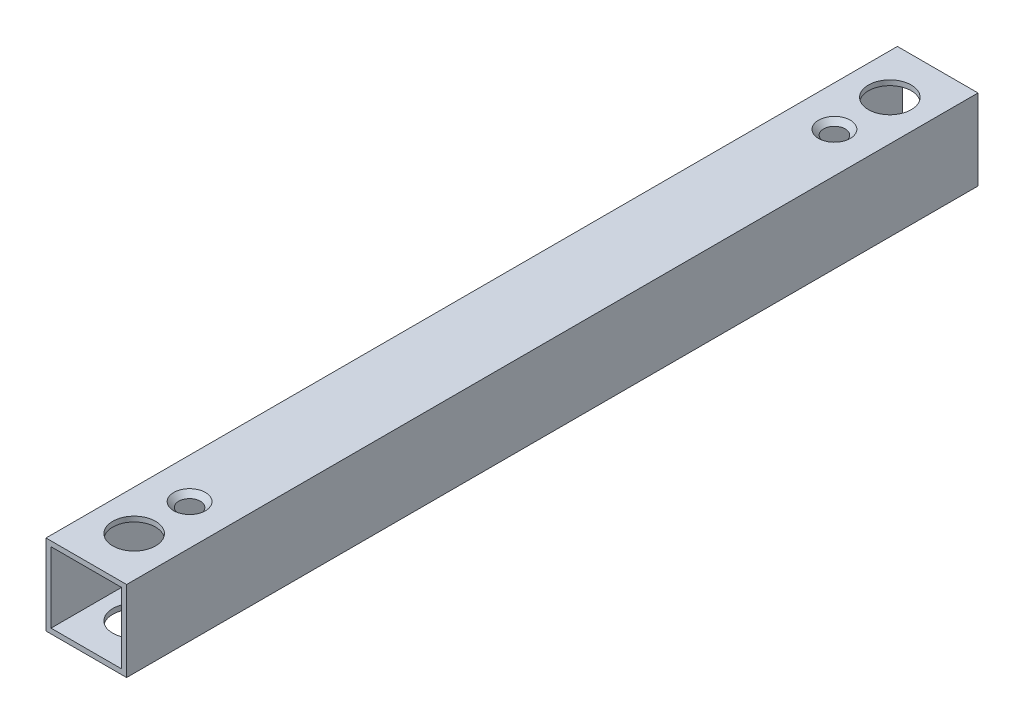
ISO-10303-21;
HEADER;
FILE_DESCRIPTION(('STEP AP214'),'2;1');
FILE_NAME('part.step','',(''),(''),'','','');
FILE_SCHEMA(('AUTOMOTIVE_DESIGN { 1 0 10303 214 1 1 1 1 }'));
ENDSEC;
DATA;
#1=APPLICATION_CONTEXT('core data for automotive mechanical design processes');
#2=APPLICATION_PROTOCOL_DEFINITION('international standard','automotive_design',2000,#1);
#3=PRODUCT_CONTEXT('',#1,'mechanical');
#4=PRODUCT('Part','Part','',(#3));
#5=PRODUCT_RELATED_PRODUCT_CATEGORY('part','',(#4));
#6=PRODUCT_DEFINITION_FORMATION('','',#4);
#7=PRODUCT_DEFINITION_CONTEXT('part definition',#1,'design');
#8=PRODUCT_DEFINITION('design','',#6,#7);
#9=PRODUCT_DEFINITION_SHAPE('','',#8);
#10=(LENGTH_UNIT() NAMED_UNIT(*) SI_UNIT(.MILLI.,.METRE.));
#11=(NAMED_UNIT(*) PLANE_ANGLE_UNIT() SI_UNIT($,.RADIAN.));
#12=(NAMED_UNIT(*) SI_UNIT($,.STERADIAN.) SOLID_ANGLE_UNIT());
#13=UNCERTAINTY_MEASURE_WITH_UNIT(LENGTH_MEASURE(1.E-05),#10,'distance_accuracy_value','');
#14=(GEOMETRIC_REPRESENTATION_CONTEXT(3) GLOBAL_UNCERTAINTY_ASSIGNED_CONTEXT((#13)) GLOBAL_UNIT_ASSIGNED_CONTEXT((#10,
#11,#12)) REPRESENTATION_CONTEXT('',''));
#15=CARTESIAN_POINT('',(0.,0.,0.));
#16=DIRECTION('',(0.,0.,1.));
#17=DIRECTION('',(1.,0.,0.));
#18=AXIS2_PLACEMENT_3D('',#15,#16,#17);
#19=CARTESIAN_POINT('',(8.,-8.,-191.62741699797));
#20=DIRECTION('',(1.,0.,0.));
#21=DIRECTION('',(0.,0.,-1.));
#22=AXIS2_PLACEMENT_3D('',#19,#20,#21);
#23=PLANE('',#22);
#24=DIRECTION('',(0.,0.,1.));
#25=VECTOR('',#24,1.);
#26=CARTESIAN_POINT('',(8.,-8.,-191.62741699797));
#27=LINE('',#26,#25);
#28=CARTESIAN_POINT('',(8.,-8.,-169.));
#29=VERTEX_POINT('',#28);
#30=CARTESIAN_POINT('',(8.,-8.,0.));
#31=VERTEX_POINT('',#30);
#32=EDGE_CURVE('E163',#29,#31,#27,.T.);
#33=ORIENTED_EDGE('',*,*,#32,.F.);
#34=DIRECTION('',(0.,1.,0.));
#35=VECTOR('',#34,1.);
#36=CARTESIAN_POINT('',(8.,-8.,-169.));
#37=LINE('',#36,#35);
#38=CARTESIAN_POINT('',(8.,8.,-169.));
#39=VERTEX_POINT('',#38);
#40=EDGE_CURVE('E155',#29,#39,#37,.T.);
#41=ORIENTED_EDGE('',*,*,#40,.T.);
#42=DIRECTION('',(0.,0.,1.));
#43=VECTOR('',#42,1.);
#44=CARTESIAN_POINT('',(8.,8.,-191.62741699797));
#45=LINE('',#44,#43);
#46=CARTESIAN_POINT('',(8.,8.,0.));
#47=VERTEX_POINT('',#46);
#48=EDGE_CURVE('E157',#39,#47,#45,.T.);
#49=ORIENTED_EDGE('',*,*,#48,.T.);
#50=DIRECTION('',(0.,1.,0.));
#51=VECTOR('',#50,1.);
#52=CARTESIAN_POINT('',(8.,-8.,0.));
#53=LINE('',#52,#51);
#54=EDGE_CURVE('E259',#31,#47,#53,.T.);
#55=ORIENTED_EDGE('',*,*,#54,.F.);
#56=EDGE_LOOP('',(#33,#41,#49,#55));
#57=FACE_BOUND('',#56,.T.);
#58=ADVANCED_FACE('F43',(#57),#23,.T.);
#59=CARTESIAN_POINT('',(-8.,-8.,-191.62741699797));
#60=DIRECTION('',(0.,-1.,0.));
#61=DIRECTION('',(0.,0.,-1.));
#62=AXIS2_PLACEMENT_3D('',#59,#60,#61);
#63=PLANE('',#62);
#64=CARTESIAN_POINT('',(0.,-8.,-20.5));
#65=DIRECTION('',(0.,-1.,0.));
#66=DIRECTION('',(0.,0.,-1.));
#67=AXIS2_PLACEMENT_3D('',#64,#65,#66);
#68=CIRCLE('',#67,3.15);
#69=CARTESIAN_POINT('',(0.,-8.,-23.65));
#70=VERTEX_POINT('',#69);
#71=EDGE_CURVE('E206',#70,#70,#68,.T.);
#72=ORIENTED_EDGE('',*,*,#71,.F.);
#73=EDGE_LOOP('',(#72));
#74=FACE_BOUND('',#73,.T.);
#75=CARTESIAN_POINT('',(0.,-8.,-148.5));
#76=DIRECTION('',(0.,-1.,0.));
#77=DIRECTION('',(0.,0.,-1.));
#78=AXIS2_PLACEMENT_3D('',#75,#76,#77);
#79=CIRCLE('',#78,3.15);
#80=CARTESIAN_POINT('',(0.,-8.,-151.65));
#81=VERTEX_POINT('',#80);
#82=EDGE_CURVE('E202',#81,#81,#79,.T.);
#83=ORIENTED_EDGE('',*,*,#82,.F.);
#84=EDGE_LOOP('',(#83));
#85=FACE_BOUND('',#84,.T.);
#86=CARTESIAN_POINT('',(0.,-8.,-159.5));
#87=DIRECTION('',(0.,1.,0.));
#88=DIRECTION('',(0.,0.,1.));
#89=AXIS2_PLACEMENT_3D('',#86,#87,#88);
#90=CIRCLE('',#89,4.25);
#91=CARTESIAN_POINT('',(0.,-8.,-155.25));
#92=VERTEX_POINT('',#91);
#93=EDGE_CURVE('E192',#92,#92,#90,.T.);
#94=ORIENTED_EDGE('',*,*,#93,.T.);
#95=EDGE_LOOP('',(#94));
#96=FACE_BOUND('',#95,.T.);
#97=CARTESIAN_POINT('',(0.,-8.,-9.5));
#98=DIRECTION('',(0.,1.,0.));
#99=DIRECTION('',(0.,0.,1.));
#100=AXIS2_PLACEMENT_3D('',#97,#98,#99);
#101=CIRCLE('',#100,4.25);
#102=CARTESIAN_POINT('',(0.,-8.,-5.25));
#103=VERTEX_POINT('',#102);
#104=EDGE_CURVE('E201',#103,#103,#101,.T.);
#105=ORIENTED_EDGE('',*,*,#104,.T.);
#106=EDGE_LOOP('',(#105));
#107=FACE_BOUND('',#106,.T.);
#108=DIRECTION('',(0.,0.,1.));
#109=VECTOR('',#108,1.);
#110=CARTESIAN_POINT('',(-8.,-8.,-191.62741699797));
#111=LINE('',#110,#109);
#112=CARTESIAN_POINT('',(-8.,-8.,-169.));
#113=VERTEX_POINT('',#112);
#114=CARTESIAN_POINT('',(-8.,-8.,0.));
#115=VERTEX_POINT('',#114);
#116=EDGE_CURVE('E167',#113,#115,#111,.T.);
#117=ORIENTED_EDGE('',*,*,#116,.F.);
#118=DIRECTION('',(1.,0.,0.));
#119=VECTOR('',#118,1.);
#120=CARTESIAN_POINT('',(-8.,-8.,-169.));
#121=LINE('',#120,#119);
#122=EDGE_CURVE('E159',#113,#29,#121,.T.);
#123=ORIENTED_EDGE('',*,*,#122,.T.);
#124=ORIENTED_EDGE('',*,*,#32,.T.);
#125=DIRECTION('',(1.,0.,0.));
#126=VECTOR('',#125,1.);
#127=CARTESIAN_POINT('',(-8.,-8.,0.));
#128=LINE('',#127,#126);
#129=EDGE_CURVE('E150',#115,#31,#128,.T.);
#130=ORIENTED_EDGE('',*,*,#129,.F.);
#131=EDGE_LOOP('',(#117,#123,#124,#130));
#132=FACE_BOUND('',#131,.T.);
#133=ADVANCED_FACE('F293',(#74,#85,#96,#107,#132),#63,.T.);
#134=CARTESIAN_POINT('',(-8.,-8.,-191.62741699797));
#135=DIRECTION('',(-1.,0.,0.));
#136=DIRECTION('',(0.,0.,1.));
#137=AXIS2_PLACEMENT_3D('',#134,#135,#136);
#138=PLANE('',#137);
#139=DIRECTION('',(0.,0.,1.));
#140=VECTOR('',#139,1.);
#141=CARTESIAN_POINT('',(-8.,8.,-191.62741699797));
#142=LINE('',#141,#140);
#143=CARTESIAN_POINT('',(-8.,8.,-169.));
#144=VERTEX_POINT('',#143);
#145=CARTESIAN_POINT('',(-8.,8.,0.));
#146=VERTEX_POINT('',#145);
#147=EDGE_CURVE('E173',#144,#146,#142,.T.);
#148=ORIENTED_EDGE('',*,*,#147,.F.);
#149=DIRECTION('',(0.,-1.,0.));
#150=VECTOR('',#149,1.);
#151=CARTESIAN_POINT('',(-8.,-8.,-169.));
#152=LINE('',#151,#150);
#153=EDGE_CURVE('E164',#144,#113,#152,.T.);
#154=ORIENTED_EDGE('',*,*,#153,.T.);
#155=ORIENTED_EDGE('',*,*,#116,.T.);
#156=DIRECTION('',(0.,-1.,0.));
#157=VECTOR('',#156,1.);
#158=CARTESIAN_POINT('',(-8.,-8.,0.));
#159=LINE('',#158,#157);
#160=EDGE_CURVE('E251',#146,#115,#159,.T.);
#161=ORIENTED_EDGE('',*,*,#160,.F.);
#162=EDGE_LOOP('',(#148,#154,#155,#161));
#163=FACE_BOUND('',#162,.T.);
#164=ADVANCED_FACE('F299',(#163),#138,.T.);
#165=CARTESIAN_POINT('',(-8.,8.,-191.62741699797));
#166=DIRECTION('',(0.,1.,0.));
#167=DIRECTION('',(0.,0.,1.));
#168=AXIS2_PLACEMENT_3D('',#165,#166,#167);
#169=PLANE('',#168);
#170=CARTESIAN_POINT('',(0.,8.,-148.5));
#171=DIRECTION('',(0.,1.,0.));
#172=DIRECTION('',(0.,0.,1.));
#173=AXIS2_PLACEMENT_3D('',#170,#171,#172);
#174=CIRCLE('',#173,3.15);
#175=CARTESIAN_POINT('',(0.,8.,-145.35));
#176=VERTEX_POINT('',#175);
#177=EDGE_CURVE('E222',#176,#176,#174,.T.);
#178=ORIENTED_EDGE('',*,*,#177,.F.);
#179=EDGE_LOOP('',(#178));
#180=FACE_BOUND('',#179,.T.);
#181=CARTESIAN_POINT('',(0.,8.,-20.5));
#182=DIRECTION('',(0.,1.,0.));
#183=DIRECTION('',(0.,0.,1.));
#184=AXIS2_PLACEMENT_3D('',#181,#182,#183);
#185=CIRCLE('',#184,3.15);
#186=CARTESIAN_POINT('',(0.,8.,-17.35));
#187=VERTEX_POINT('',#186);
#188=EDGE_CURVE('E210',#187,#187,#185,.T.);
#189=ORIENTED_EDGE('',*,*,#188,.F.);
#190=EDGE_LOOP('',(#189));
#191=FACE_BOUND('',#190,.T.);
#192=CARTESIAN_POINT('',(0.,8.,-159.5));
#193=DIRECTION('',(0.,1.,0.));
#194=DIRECTION('',(0.,0.,1.));
#195=AXIS2_PLACEMENT_3D('',#192,#193,#194);
#196=CIRCLE('',#195,4.25);
#197=CARTESIAN_POINT('',(0.,8.,-155.25));
#198=VERTEX_POINT('',#197);
#199=EDGE_CURVE('E231',#198,#198,#196,.T.);
#200=ORIENTED_EDGE('',*,*,#199,.F.);
#201=EDGE_LOOP('',(#200));
#202=FACE_BOUND('',#201,.T.);
#203=CARTESIAN_POINT('',(0.,8.,-9.5));
#204=DIRECTION('',(0.,1.,0.));
#205=DIRECTION('',(0.,0.,1.));
#206=AXIS2_PLACEMENT_3D('',#203,#204,#205);
#207=CIRCLE('',#206,4.25);
#208=CARTESIAN_POINT('',(0.,8.,-5.25));
#209=VERTEX_POINT('',#208);
#210=EDGE_CURVE('E235',#209,#209,#207,.T.);
#211=ORIENTED_EDGE('',*,*,#210,.F.);
#212=EDGE_LOOP('',(#211));
#213=FACE_BOUND('',#212,.T.);
#214=ORIENTED_EDGE('',*,*,#48,.F.);
#215=DIRECTION('',(-1.,0.,0.));
#216=VECTOR('',#215,1.);
#217=CARTESIAN_POINT('',(-8.,8.,-169.));
#218=LINE('',#217,#216);
#219=EDGE_CURVE('E65',#39,#144,#218,.T.);
#220=ORIENTED_EDGE('',*,*,#219,.T.);
#221=ORIENTED_EDGE('',*,*,#147,.T.);
#222=DIRECTION('',(-1.,0.,0.));
#223=VECTOR('',#222,1.);
#224=CARTESIAN_POINT('',(-8.,8.,0.));
#225=LINE('',#224,#223);
#226=EDGE_CURVE('E255',#47,#146,#225,.T.);
#227=ORIENTED_EDGE('',*,*,#226,.F.);
#228=EDGE_LOOP('',(#214,#220,#221,#227));
#229=FACE_BOUND('',#228,.T.);
#230=ADVANCED_FACE('F290',(#180,#191,#202,#213,#229),#169,.T.);
#231=CARTESIAN_POINT('',(7.,-7.,-191.62741699797));
#232=DIRECTION('',(1.,0.,0.));
#233=DIRECTION('',(0.,0.,-1.));
#234=AXIS2_PLACEMENT_3D('',#231,#232,#233);
#235=PLANE('',#234);
#236=DIRECTION('',(0.,1.,0.));
#237=VECTOR('',#236,1.);
#238=CARTESIAN_POINT('',(7.,-7.,-169.));
#239=LINE('',#238,#237);
#240=CARTESIAN_POINT('',(7.,-7.,-169.));
#241=VERTEX_POINT('',#240);
#242=CARTESIAN_POINT('',(7.,7.,-169.));
#243=VERTEX_POINT('',#242);
#244=EDGE_CURVE('E124',#241,#243,#239,.T.);
#245=ORIENTED_EDGE('',*,*,#244,.F.);
#246=DIRECTION('',(0.,0.,1.));
#247=VECTOR('',#246,1.);
#248=CARTESIAN_POINT('',(7.,-7.,-191.62741699797));
#249=LINE('',#248,#247);
#250=CARTESIAN_POINT('',(7.,-7.,0.));
#251=VERTEX_POINT('',#250);
#252=EDGE_CURVE('E176',#241,#251,#249,.T.);
#253=ORIENTED_EDGE('',*,*,#252,.T.);
#254=DIRECTION('',(0.,1.,0.));
#255=VECTOR('',#254,1.);
#256=CARTESIAN_POINT('',(7.,-7.,0.));
#257=LINE('',#256,#255);
#258=CARTESIAN_POINT('',(7.,7.,0.));
#259=VERTEX_POINT('',#258);
#260=EDGE_CURVE('E127',#251,#259,#257,.T.);
#261=ORIENTED_EDGE('',*,*,#260,.T.);
#262=DIRECTION('',(0.,0.,1.));
#263=VECTOR('',#262,1.);
#264=CARTESIAN_POINT('',(7.,7.,-191.62741699797));
#265=LINE('',#264,#263);
#266=EDGE_CURVE('E120',#243,#259,#265,.T.);
#267=ORIENTED_EDGE('',*,*,#266,.F.);
#268=EDGE_LOOP('',(#245,#253,#261,#267));
#269=FACE_BOUND('',#268,.T.);
#270=ADVANCED_FACE('F122',(#269),#235,.F.);
#271=CARTESIAN_POINT('',(-7.,-7.,-191.62741699797));
#272=DIRECTION('',(0.,-1.,0.));
#273=DIRECTION('',(0.,0.,-1.));
#274=AXIS2_PLACEMENT_3D('',#271,#272,#273);
#275=PLANE('',#274);
#276=CARTESIAN_POINT('',(0.,-7.,-20.5));
#277=DIRECTION('',(0.,-1.,0.));
#278=DIRECTION('',(0.,0.,-1.));
#279=AXIS2_PLACEMENT_3D('',#276,#277,#278);
#280=CIRCLE('',#279,2.14999999999999);
#281=CARTESIAN_POINT('',(0.,-7.,-22.65));
#282=VERTEX_POINT('',#281);
#283=EDGE_CURVE('E203',#282,#282,#280,.T.);
#284=ORIENTED_EDGE('',*,*,#283,.T.);
#285=EDGE_LOOP('',(#284));
#286=FACE_BOUND('',#285,.T.);
#287=CARTESIAN_POINT('',(0.,-7.,-148.5));
#288=DIRECTION('',(0.,-1.,0.));
#289=DIRECTION('',(0.,0.,-1.));
#290=AXIS2_PLACEMENT_3D('',#287,#288,#289);
#291=CIRCLE('',#290,2.14999999999999);
#292=CARTESIAN_POINT('',(0.,-7.,-150.65));
#293=VERTEX_POINT('',#292);
#294=EDGE_CURVE('E197',#293,#293,#291,.T.);
#295=ORIENTED_EDGE('',*,*,#294,.T.);
#296=EDGE_LOOP('',(#295));
#297=FACE_BOUND('',#296,.T.);
#298=CARTESIAN_POINT('',(0.,-7.,-159.5));
#299=DIRECTION('',(0.,-1.,0.));
#300=DIRECTION('',(0.,0.,-1.));
#301=AXIS2_PLACEMENT_3D('',#298,#299,#300);
#302=CIRCLE('',#301,4.25);
#303=CARTESIAN_POINT('',(0.,-7.,-163.75));
#304=VERTEX_POINT('',#303);
#305=EDGE_CURVE('E158',#304,#304,#302,.T.);
#306=ORIENTED_EDGE('',*,*,#305,.T.);
#307=EDGE_LOOP('',(#306));
#308=FACE_BOUND('',#307,.T.);
#309=CARTESIAN_POINT('',(0.,-7.,-9.5));
#310=DIRECTION('',(0.,-1.,0.));
#311=DIRECTION('',(0.,0.,-1.));
#312=AXIS2_PLACEMENT_3D('',#309,#310,#311);
#313=CIRCLE('',#312,4.25);
#314=CARTESIAN_POINT('',(0.,-7.,-13.75));
#315=VERTEX_POINT('',#314);
#316=EDGE_CURVE('E191',#315,#315,#313,.T.);
#317=ORIENTED_EDGE('',*,*,#316,.T.);
#318=EDGE_LOOP('',(#317));
#319=FACE_BOUND('',#318,.T.);
#320=DIRECTION('',(1.,0.,0.));
#321=VECTOR('',#320,1.);
#322=CARTESIAN_POINT('',(-7.,-7.,-169.));
#323=LINE('',#322,#321);
#324=CARTESIAN_POINT('',(-7.,-7.,-169.));
#325=VERTEX_POINT('',#324);
#326=EDGE_CURVE('E144',#325,#241,#323,.T.);
#327=ORIENTED_EDGE('',*,*,#326,.F.);
#328=DIRECTION('',(0.,0.,1.));
#329=VECTOR('',#328,1.);
#330=CARTESIAN_POINT('',(-7.,-7.,-191.62741699797));
#331=LINE('',#330,#329);
#332=CARTESIAN_POINT('',(-7.,-7.,0.));
#333=VERTEX_POINT('',#332);
#334=EDGE_CURVE('E181',#325,#333,#331,.T.);
#335=ORIENTED_EDGE('',*,*,#334,.T.);
#336=DIRECTION('',(1.,0.,0.));
#337=VECTOR('',#336,1.);
#338=CARTESIAN_POINT('',(-7.,-7.,0.));
#339=LINE('',#338,#337);
#340=EDGE_CURVE('E184',#333,#251,#339,.T.);
#341=ORIENTED_EDGE('',*,*,#340,.T.);
#342=ORIENTED_EDGE('',*,*,#252,.F.);
#343=EDGE_LOOP('',(#327,#335,#341,#342));
#344=FACE_BOUND('',#343,.T.);
#345=ADVANCED_FACE('F281',(#286,#297,#308,#319,#344),#275,.F.);
#346=CARTESIAN_POINT('',(-7.,-7.,-191.62741699797));
#347=DIRECTION('',(-1.,0.,0.));
#348=DIRECTION('',(0.,0.,1.));
#349=AXIS2_PLACEMENT_3D('',#346,#347,#348);
#350=PLANE('',#349);
#351=DIRECTION('',(0.,-1.,0.));
#352=VECTOR('',#351,1.);
#353=CARTESIAN_POINT('',(-7.,-7.,-169.));
#354=LINE('',#353,#352);
#355=CARTESIAN_POINT('',(-7.,7.,-169.));
#356=VERTEX_POINT('',#355);
#357=EDGE_CURVE('E11',#356,#325,#354,.T.);
#358=ORIENTED_EDGE('',*,*,#357,.F.);
#359=DIRECTION('',(0.,0.,1.));
#360=VECTOR('',#359,1.);
#361=CARTESIAN_POINT('',(-7.,7.,-191.62741699797));
#362=LINE('',#361,#360);
#363=CARTESIAN_POINT('',(-7.,7.,0.));
#364=VERTEX_POINT('',#363);
#365=EDGE_CURVE('E138',#356,#364,#362,.T.);
#366=ORIENTED_EDGE('',*,*,#365,.T.);
#367=DIRECTION('',(0.,-1.,0.));
#368=VECTOR('',#367,1.);
#369=CARTESIAN_POINT('',(-7.,-7.,0.));
#370=LINE('',#369,#368);
#371=EDGE_CURVE('E133',#364,#333,#370,.T.);
#372=ORIENTED_EDGE('',*,*,#371,.T.);
#373=ORIENTED_EDGE('',*,*,#334,.F.);
#374=EDGE_LOOP('',(#358,#366,#372,#373));
#375=FACE_BOUND('',#374,.T.);
#376=ADVANCED_FACE('F278',(#375),#350,.F.);
#377=CARTESIAN_POINT('',(-7.,7.,-191.62741699797));
#378=DIRECTION('',(0.,1.,0.));
#379=DIRECTION('',(0.,0.,1.));
#380=AXIS2_PLACEMENT_3D('',#377,#378,#379);
#381=PLANE('',#380);
#382=CARTESIAN_POINT('',(0.,7.,-148.5));
#383=DIRECTION('',(0.,1.,0.));
#384=DIRECTION('',(0.,0.,1.));
#385=AXIS2_PLACEMENT_3D('',#382,#383,#384);
#386=CIRCLE('',#385,2.15);
#387=CARTESIAN_POINT('',(0.,7.,-146.35));
#388=VERTEX_POINT('',#387);
#389=EDGE_CURVE('E47',#388,#388,#386,.T.);
#390=ORIENTED_EDGE('',*,*,#389,.T.);
#391=EDGE_LOOP('',(#390));
#392=FACE_BOUND('',#391,.T.);
#393=CARTESIAN_POINT('',(0.,7.,-20.5));
#394=DIRECTION('',(0.,1.,0.));
#395=DIRECTION('',(0.,0.,1.));
#396=AXIS2_PLACEMENT_3D('',#393,#394,#395);
#397=CIRCLE('',#396,2.15);
#398=CARTESIAN_POINT('',(0.,7.,-18.35));
#399=VERTEX_POINT('',#398);
#400=EDGE_CURVE('E207',#399,#399,#397,.T.);
#401=ORIENTED_EDGE('',*,*,#400,.T.);
#402=EDGE_LOOP('',(#401));
#403=FACE_BOUND('',#402,.T.);
#404=CARTESIAN_POINT('',(0.,7.,-159.5));
#405=DIRECTION('',(0.,1.,0.));
#406=DIRECTION('',(0.,0.,1.));
#407=AXIS2_PLACEMENT_3D('',#404,#405,#406);
#408=CIRCLE('',#407,4.25);
#409=CARTESIAN_POINT('',(0.,7.,-155.25));
#410=VERTEX_POINT('',#409);
#411=EDGE_CURVE('E193',#410,#410,#408,.T.);
#412=ORIENTED_EDGE('',*,*,#411,.T.);
#413=EDGE_LOOP('',(#412));
#414=FACE_BOUND('',#413,.T.);
#415=CARTESIAN_POINT('',(0.,7.,-9.5));
#416=DIRECTION('',(0.,1.,0.));
#417=DIRECTION('',(0.,0.,1.));
#418=AXIS2_PLACEMENT_3D('',#415,#416,#417);
#419=CIRCLE('',#418,4.25);
#420=CARTESIAN_POINT('',(0.,7.,-5.25));
#421=VERTEX_POINT('',#420);
#422=EDGE_CURVE('E187',#421,#421,#419,.T.);
#423=ORIENTED_EDGE('',*,*,#422,.T.);
#424=EDGE_LOOP('',(#423));
#425=FACE_BOUND('',#424,.T.);
#426=DIRECTION('',(-1.,0.,0.));
#427=VECTOR('',#426,1.);
#428=CARTESIAN_POINT('',(-7.,7.,-169.));
#429=LINE('',#428,#427);
#430=EDGE_CURVE('E54',#243,#356,#429,.T.);
#431=ORIENTED_EDGE('',*,*,#430,.F.);
#432=ORIENTED_EDGE('',*,*,#266,.T.);
#433=DIRECTION('',(-1.,0.,0.));
#434=VECTOR('',#433,1.);
#435=CARTESIAN_POINT('',(-7.,7.,0.));
#436=LINE('',#435,#434);
#437=EDGE_CURVE('E132',#259,#364,#436,.T.);
#438=ORIENTED_EDGE('',*,*,#437,.T.);
#439=ORIENTED_EDGE('',*,*,#365,.F.);
#440=EDGE_LOOP('',(#431,#432,#438,#439));
#441=FACE_BOUND('',#440,.T.);
#442=ADVANCED_FACE('F137',(#392,#403,#414,#425,#441),#381,.F.);
#443=CARTESIAN_POINT('',(0.,0.,0.));
#444=DIRECTION('',(0.,0.,-1.));
#445=DIRECTION('',(-1.,0.,0.));
#446=AXIS2_PLACEMENT_3D('',#443,#444,#445);
#447=PLANE('',#446);
#448=ORIENTED_EDGE('',*,*,#437,.F.);
#449=ORIENTED_EDGE('',*,*,#260,.F.);
#450=ORIENTED_EDGE('',*,*,#340,.F.);
#451=ORIENTED_EDGE('',*,*,#371,.F.);
#452=EDGE_LOOP('',(#448,#449,#450,#451));
#453=FACE_BOUND('',#452,.T.);
#454=ORIENTED_EDGE('',*,*,#54,.T.);
#455=ORIENTED_EDGE('',*,*,#226,.T.);
#456=ORIENTED_EDGE('',*,*,#160,.T.);
#457=ORIENTED_EDGE('',*,*,#129,.T.);
#458=EDGE_LOOP('',(#454,#455,#456,#457));
#459=FACE_BOUND('',#458,.T.);
#460=ADVANCED_FACE('F274',(#453,#459),#447,.F.);
#461=CARTESIAN_POINT('',(0.,0.,-169.));
#462=DIRECTION('',(0.,0.,-1.));
#463=DIRECTION('',(-1.,0.,0.));
#464=AXIS2_PLACEMENT_3D('',#461,#462,#463);
#465=PLANE('',#464);
#466=ORIENTED_EDGE('',*,*,#40,.F.);
#467=ORIENTED_EDGE('',*,*,#122,.F.);
#468=ORIENTED_EDGE('',*,*,#153,.F.);
#469=ORIENTED_EDGE('',*,*,#219,.F.);
#470=EDGE_LOOP('',(#466,#467,#468,#469));
#471=FACE_BOUND('',#470,.T.);
#472=ORIENTED_EDGE('',*,*,#326,.T.);
#473=ORIENTED_EDGE('',*,*,#244,.T.);
#474=ORIENTED_EDGE('',*,*,#430,.T.);
#475=ORIENTED_EDGE('',*,*,#357,.T.);
#476=EDGE_LOOP('',(#472,#473,#474,#475));
#477=FACE_BOUND('',#476,.T.);
#478=ADVANCED_FACE('F45',(#471,#477),#465,.T.);
#479=CARTESIAN_POINT('',(0.,-8.,-9.5));
#480=DIRECTION('',(0.,1.,0.));
#481=DIRECTION('',(0.,0.,1.));
#482=AXIS2_PLACEMENT_3D('',#479,#480,#481);
#483=CYLINDRICAL_SURFACE('',#482,4.25);
#484=ORIENTED_EDGE('',*,*,#210,.T.);
#485=EDGE_LOOP('',(#484));
#486=FACE_BOUND('',#485,.T.);
#487=ORIENTED_EDGE('',*,*,#422,.F.);
#488=EDGE_LOOP('',(#487));
#489=FACE_BOUND('',#488,.T.);
#490=ADVANCED_FACE('F317',(#486,#489),#483,.F.);
#491=CARTESIAN_POINT('',(0.,-8.,-159.5));
#492=DIRECTION('',(0.,1.,0.));
#493=DIRECTION('',(0.,0.,1.));
#494=AXIS2_PLACEMENT_3D('',#491,#492,#493);
#495=CYLINDRICAL_SURFACE('',#494,4.25);
#496=ORIENTED_EDGE('',*,*,#199,.T.);
#497=EDGE_LOOP('',(#496));
#498=FACE_BOUND('',#497,.T.);
#499=ORIENTED_EDGE('',*,*,#411,.F.);
#500=EDGE_LOOP('',(#499));
#501=FACE_BOUND('',#500,.T.);
#502=ADVANCED_FACE('F319',(#498,#501),#495,.F.);
#503=ORIENTED_EDGE('',*,*,#104,.F.);
#504=EDGE_LOOP('',(#503));
#505=FACE_BOUND('',#504,.T.);
#506=ORIENTED_EDGE('',*,*,#316,.F.);
#507=EDGE_LOOP('',(#506));
#508=FACE_BOUND('',#507,.T.);
#509=ADVANCED_FACE('F322',(#505,#508),#483,.F.);
#510=ORIENTED_EDGE('',*,*,#93,.F.);
#511=EDGE_LOOP('',(#510));
#512=FACE_BOUND('',#511,.T.);
#513=ORIENTED_EDGE('',*,*,#305,.F.);
#514=EDGE_LOOP('',(#513));
#515=FACE_BOUND('',#514,.T.);
#516=ADVANCED_FACE('F329',(#512,#515),#495,.F.);
#517=CARTESIAN_POINT('',(0.,-8.,-148.5));
#518=DIRECTION('',(0.,-1.,0.));
#519=DIRECTION('',(0.,0.,-1.));
#520=AXIS2_PLACEMENT_3D('',#517,#518,#519);
#521=CONICAL_SURFACE('',#520,3.15,0.78539816339745);
#522=ORIENTED_EDGE('',*,*,#82,.T.);
#523=EDGE_LOOP('',(#522));
#524=FACE_BOUND('',#523,.T.);
#525=ORIENTED_EDGE('',*,*,#294,.F.);
#526=EDGE_LOOP('',(#525));
#527=FACE_BOUND('',#526,.T.);
#528=ADVANCED_FACE('F335',(#524,#527),#521,.F.);
#529=CARTESIAN_POINT('',(0.,-8.,-20.5));
#530=DIRECTION('',(0.,-1.,0.));
#531=DIRECTION('',(0.,0.,-1.));
#532=AXIS2_PLACEMENT_3D('',#529,#530,#531);
#533=CONICAL_SURFACE('',#532,3.15,0.78539816339745);
#534=ORIENTED_EDGE('',*,*,#71,.T.);
#535=EDGE_LOOP('',(#534));
#536=FACE_BOUND('',#535,.T.);
#537=ORIENTED_EDGE('',*,*,#283,.F.);
#538=EDGE_LOOP('',(#537));
#539=FACE_BOUND('',#538,.T.);
#540=ADVANCED_FACE('F415',(#536,#539),#533,.F.);
#541=CARTESIAN_POINT('',(0.,8.,-20.5));
#542=DIRECTION('',(0.,1.,0.));
#543=DIRECTION('',(0.,0.,1.));
#544=AXIS2_PLACEMENT_3D('',#541,#542,#543);
#545=CONICAL_SURFACE('',#544,3.15,0.78539816339745);
#546=ORIENTED_EDGE('',*,*,#188,.T.);
#547=EDGE_LOOP('',(#546));
#548=FACE_BOUND('',#547,.T.);
#549=ORIENTED_EDGE('',*,*,#400,.F.);
#550=EDGE_LOOP('',(#549));
#551=FACE_BOUND('',#550,.T.);
#552=ADVANCED_FACE('F411',(#548,#551),#545,.F.);
#553=CARTESIAN_POINT('',(0.,8.,-148.5));
#554=DIRECTION('',(0.,1.,0.));
#555=DIRECTION('',(0.,0.,1.));
#556=AXIS2_PLACEMENT_3D('',#553,#554,#555);
#557=CONICAL_SURFACE('',#556,3.15,0.78539816339745);
#558=ORIENTED_EDGE('',*,*,#177,.T.);
#559=EDGE_LOOP('',(#558));
#560=FACE_BOUND('',#559,.T.);
#561=ORIENTED_EDGE('',*,*,#389,.F.);
#562=EDGE_LOOP('',(#561));
#563=FACE_BOUND('',#562,.T.);
#564=ADVANCED_FACE('F357',(#560,#563),#557,.F.);
#565=CLOSED_SHELL('',(#58,#133,#164,#230,#270,#345,#376,#442,#460,#478,#490,#502,#509,#516,#528,
#540,#552,#564));
#566=MANIFOLD_SOLID_BREP('B2',#565);
#567=ADVANCED_BREP_SHAPE_REPRESENTATION('',(#18,#566),#14);
#568=SHAPE_DEFINITION_REPRESENTATION(#9,#567);
ENDSEC;
END-ISO-10303-21;
